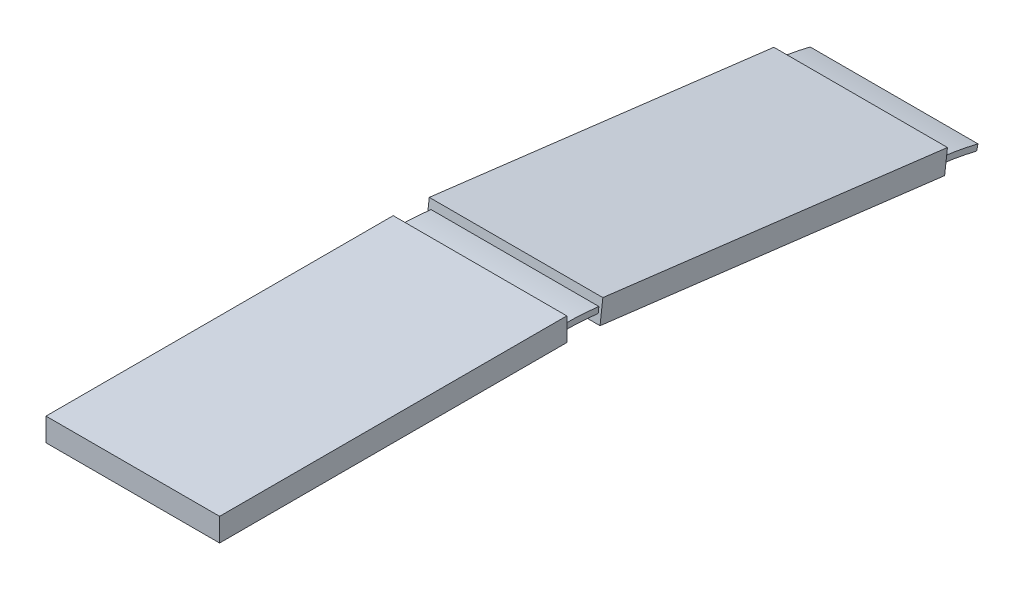
ISO-10303-21;
HEADER;
FILE_DESCRIPTION(('STEP AP214'),'2;1');
FILE_NAME('part.step','',(''),(''),'','','');
FILE_SCHEMA(('AUTOMOTIVE_DESIGN { 1 0 10303 214 1 1 1 1 }'));
ENDSEC;
DATA;
#1=APPLICATION_CONTEXT('core data for automotive mechanical design processes');
#2=APPLICATION_PROTOCOL_DEFINITION('international standard','automotive_design',2000,#1);
#3=PRODUCT_CONTEXT('',#1,'mechanical');
#4=PRODUCT('Part','Part','',(#3));
#5=PRODUCT_RELATED_PRODUCT_CATEGORY('part','',(#4));
#6=PRODUCT_DEFINITION_FORMATION('','',#4);
#7=PRODUCT_DEFINITION_CONTEXT('part definition',#1,'design');
#8=PRODUCT_DEFINITION('design','',#6,#7);
#9=PRODUCT_DEFINITION_SHAPE('','',#8);
#10=(LENGTH_UNIT() NAMED_UNIT(*) SI_UNIT(.MILLI.,.METRE.));
#11=(NAMED_UNIT(*) PLANE_ANGLE_UNIT() SI_UNIT($,.RADIAN.));
#12=(NAMED_UNIT(*) SI_UNIT($,.STERADIAN.) SOLID_ANGLE_UNIT());
#13=UNCERTAINTY_MEASURE_WITH_UNIT(LENGTH_MEASURE(1.E-05),#10,'distance_accuracy_value','');
#14=(GEOMETRIC_REPRESENTATION_CONTEXT(3) GLOBAL_UNCERTAINTY_ASSIGNED_CONTEXT((#13)) GLOBAL_UNIT_ASSIGNED_CONTEXT((#10,
#11,#12)) REPRESENTATION_CONTEXT('',''));
#15=CARTESIAN_POINT('',(0.,0.,0.));
#16=DIRECTION('',(0.,0.,1.));
#17=DIRECTION('',(1.,0.,0.));
#18=AXIS2_PLACEMENT_3D('',#15,#16,#17);
#19=CARTESIAN_POINT('',(-0.75,0.1,1.5));
#20=DIRECTION('',(1.,0.,0.));
#21=DIRECTION('',(0.,0.,-1.));
#22=AXIS2_PLACEMENT_3D('',#19,#20,#21);
#23=PLANE('',#22);
#24=DIRECTION('',(0.,0.,1.));
#25=VECTOR('',#24,1.);
#26=CARTESIAN_POINT('',(-0.75,-0.1,1.5));
#27=LINE('',#26,#25);
#28=CARTESIAN_POINT('',(-0.75,-0.1,-1.5));
#29=VERTEX_POINT('',#28);
#30=CARTESIAN_POINT('',(-0.75,-0.1,1.5));
#31=VERTEX_POINT('',#30);
#32=EDGE_CURVE('E303',#29,#31,#27,.T.);
#33=ORIENTED_EDGE('',*,*,#32,.T.);
#34=DIRECTION('',(0.,-1.,0.));
#35=VECTOR('',#34,1.);
#36=CARTESIAN_POINT('',(-0.75,0.1,1.5));
#37=LINE('',#36,#35);
#38=CARTESIAN_POINT('',(-0.75,0.1,1.5));
#39=VERTEX_POINT('',#38);
#40=EDGE_CURVE('E11',#39,#31,#37,.T.);
#41=ORIENTED_EDGE('',*,*,#40,.F.);
#42=DIRECTION('',(0.,0.,1.));
#43=VECTOR('',#42,1.);
#44=CARTESIAN_POINT('',(-0.75,0.1,1.5));
#45=LINE('',#44,#43);
#46=CARTESIAN_POINT('',(-0.75,0.1,-1.5));
#47=VERTEX_POINT('',#46);
#48=EDGE_CURVE('E304',#47,#39,#45,.T.);
#49=ORIENTED_EDGE('',*,*,#48,.F.);
#50=DIRECTION('',(0.,-1.,0.));
#51=VECTOR('',#50,1.);
#52=CARTESIAN_POINT('',(-0.75,0.1,-1.5));
#53=LINE('',#52,#51);
#54=EDGE_CURVE('E318',#47,#29,#53,.T.);
#55=ORIENTED_EDGE('',*,*,#54,.T.);
#56=EDGE_LOOP('',(#33,#41,#49,#55));
#57=FACE_BOUND('',#56,.T.);
#58=ADVANCED_FACE('F43',(#57),#23,.F.);
#59=CARTESIAN_POINT('',(0.75,0.1,1.5));
#60=DIRECTION('',(0.,0.,-1.));
#61=DIRECTION('',(-1.,0.,0.));
#62=AXIS2_PLACEMENT_3D('',#59,#60,#61);
#63=PLANE('',#62);
#64=DIRECTION('',(1.,0.,0.));
#65=VECTOR('',#64,1.);
#66=CARTESIAN_POINT('',(0.75,-0.1,1.5));
#67=LINE('',#66,#65);
#68=CARTESIAN_POINT('',(0.75,-0.1,1.5));
#69=VERTEX_POINT('',#68);
#70=EDGE_CURVE('E322',#31,#69,#67,.T.);
#71=ORIENTED_EDGE('',*,*,#70,.T.);
#72=DIRECTION('',(0.,-1.,0.));
#73=VECTOR('',#72,1.);
#74=CARTESIAN_POINT('',(0.75,0.1,1.5));
#75=LINE('',#74,#73);
#76=CARTESIAN_POINT('',(0.75,0.1,1.5));
#77=VERTEX_POINT('',#76);
#78=EDGE_CURVE('E51',#77,#69,#75,.T.);
#79=ORIENTED_EDGE('',*,*,#78,.F.);
#80=DIRECTION('',(1.,0.,0.));
#81=VECTOR('',#80,1.);
#82=CARTESIAN_POINT('',(0.75,0.1,1.5));
#83=LINE('',#82,#81);
#84=EDGE_CURVE('E308',#39,#77,#83,.T.);
#85=ORIENTED_EDGE('',*,*,#84,.F.);
#86=ORIENTED_EDGE('',*,*,#40,.T.);
#87=EDGE_LOOP('',(#71,#79,#85,#86));
#88=FACE_BOUND('',#87,.T.);
#89=ADVANCED_FACE('F358',(#88),#63,.F.);
#90=CARTESIAN_POINT('',(0.75,0.1,1.5));
#91=DIRECTION('',(-1.,0.,0.));
#92=DIRECTION('',(0.,0.,1.));
#93=AXIS2_PLACEMENT_3D('',#90,#91,#92);
#94=PLANE('',#93);
#95=DIRECTION('',(0.,0.,-1.));
#96=VECTOR('',#95,1.);
#97=CARTESIAN_POINT('',(0.75,-0.1,1.5));
#98=LINE('',#97,#96);
#99=CARTESIAN_POINT('',(0.75,-0.1,-1.5));
#100=VERTEX_POINT('',#99);
#101=EDGE_CURVE('E325',#69,#100,#98,.T.);
#102=ORIENTED_EDGE('',*,*,#101,.T.);
#103=DIRECTION('',(0.,-1.,0.));
#104=VECTOR('',#103,1.);
#105=CARTESIAN_POINT('',(0.75,0.1,-1.5));
#106=LINE('',#105,#104);
#107=CARTESIAN_POINT('',(0.75,0.1,-1.5));
#108=VERTEX_POINT('',#107);
#109=EDGE_CURVE('E333',#108,#100,#106,.T.);
#110=ORIENTED_EDGE('',*,*,#109,.F.);
#111=DIRECTION('',(0.,0.,-1.));
#112=VECTOR('',#111,1.);
#113=CARTESIAN_POINT('',(0.75,0.1,1.5));
#114=LINE('',#113,#112);
#115=EDGE_CURVE('E312',#77,#108,#114,.T.);
#116=ORIENTED_EDGE('',*,*,#115,.F.);
#117=ORIENTED_EDGE('',*,*,#78,.T.);
#118=EDGE_LOOP('',(#102,#110,#116,#117));
#119=FACE_BOUND('',#118,.T.);
#120=ADVANCED_FACE('F342',(#119),#94,.F.);
#121=CARTESIAN_POINT('',(0.75,0.1,-1.5));
#122=DIRECTION('',(0.,0.,1.));
#123=DIRECTION('',(1.,0.,0.));
#124=AXIS2_PLACEMENT_3D('',#121,#122,#123);
#125=PLANE('',#124);
#126=DIRECTION('',(-1.,0.,0.));
#127=VECTOR('',#126,1.);
#128=CARTESIAN_POINT('',(0.725,0.025,-1.5));
#129=LINE('',#128,#127);
#130=CARTESIAN_POINT('',(0.725,0.025,-1.5));
#131=VERTEX_POINT('',#130);
#132=CARTESIAN_POINT('',(-0.725,0.025,-1.5));
#133=VERTEX_POINT('',#132);
#134=EDGE_CURVE('E299',#131,#133,#129,.T.);
#135=ORIENTED_EDGE('',*,*,#134,.T.);
#136=DIRECTION('',(0.,-1.,0.));
#137=VECTOR('',#136,1.);
#138=CARTESIAN_POINT('',(-0.725,0.025,-1.5));
#139=LINE('',#138,#137);
#140=CARTESIAN_POINT('',(-0.725,-0.025,-1.5));
#141=VERTEX_POINT('',#140);
#142=EDGE_CURVE('E279',#133,#141,#139,.T.);
#143=ORIENTED_EDGE('',*,*,#142,.T.);
#144=DIRECTION('',(-1.,0.,0.));
#145=VECTOR('',#144,1.);
#146=CARTESIAN_POINT('',(0.725,-0.025,-1.5));
#147=LINE('',#146,#145);
#148=CARTESIAN_POINT('',(0.725,-0.025,-1.5));
#149=VERTEX_POINT('',#148);
#150=EDGE_CURVE('E296',#149,#141,#147,.T.);
#151=ORIENTED_EDGE('',*,*,#150,.F.);
#152=DIRECTION('',(0.,-1.,0.));
#153=VECTOR('',#152,1.);
#154=CARTESIAN_POINT('',(0.725,0.025,-1.5));
#155=LINE('',#154,#153);
#156=EDGE_CURVE('E266',#131,#149,#155,.T.);
#157=ORIENTED_EDGE('',*,*,#156,.F.);
#158=EDGE_LOOP('',(#135,#143,#151,#157));
#159=FACE_BOUND('',#158,.T.);
#160=DIRECTION('',(-1.,0.,0.));
#161=VECTOR('',#160,1.);
#162=CARTESIAN_POINT('',(0.75,-0.1,-1.5));
#163=LINE('',#162,#161);
#164=EDGE_CURVE('E309',#100,#29,#163,.T.);
#165=ORIENTED_EDGE('',*,*,#164,.T.);
#166=ORIENTED_EDGE('',*,*,#54,.F.);
#167=DIRECTION('',(-1.,0.,0.));
#168=VECTOR('',#167,1.);
#169=CARTESIAN_POINT('',(0.75,0.1,-1.5));
#170=LINE('',#169,#168);
#171=EDGE_CURVE('E315',#108,#47,#170,.T.);
#172=ORIENTED_EDGE('',*,*,#171,.F.);
#173=ORIENTED_EDGE('',*,*,#109,.T.);
#174=EDGE_LOOP('',(#165,#166,#172,#173));
#175=FACE_BOUND('',#174,.T.);
#176=ADVANCED_FACE('F351',(#159,#175),#125,.F.);
#177=CARTESIAN_POINT('',(0.,0.1,0.));
#178=DIRECTION('',(0.,1.,0.));
#179=DIRECTION('',(0.,0.,1.));
#180=AXIS2_PLACEMENT_3D('',#177,#178,#179);
#181=PLANE('',#180);
#182=ORIENTED_EDGE('',*,*,#48,.T.);
#183=ORIENTED_EDGE('',*,*,#84,.T.);
#184=ORIENTED_EDGE('',*,*,#115,.T.);
#185=ORIENTED_EDGE('',*,*,#171,.T.);
#186=EDGE_LOOP('',(#182,#183,#184,#185));
#187=FACE_BOUND('',#186,.T.);
#188=ADVANCED_FACE('F357',(#187),#181,.T.);
#189=CARTESIAN_POINT('',(0.,-0.1,0.));
#190=DIRECTION('',(0.,1.,0.));
#191=DIRECTION('',(0.,0.,1.));
#192=AXIS2_PLACEMENT_3D('',#189,#190,#191);
#193=PLANE('',#192);
#194=ORIENTED_EDGE('',*,*,#32,.F.);
#195=ORIENTED_EDGE('',*,*,#164,.F.);
#196=ORIENTED_EDGE('',*,*,#101,.F.);
#197=ORIENTED_EDGE('',*,*,#70,.F.);
#198=EDGE_LOOP('',(#194,#195,#196,#197));
#199=FACE_BOUND('',#198,.T.);
#200=ADVANCED_FACE('F348',(#199),#193,.F.);
#201=CARTESIAN_POINT('',(0.725,-2.45706123590973,-1.5));
#202=DIRECTION('',(-1.,0.,0.));
#203=DIRECTION('',(0.,0.,1.));
#204=AXIS2_PLACEMENT_3D('',#201,#202,#203);
#205=CYLINDRICAL_SURFACE('',#204,2.48206123590973);
#206=CARTESIAN_POINT('',(-0.725,-2.45706123590973,-1.5));
#207=DIRECTION('',(1.,0.,0.));
#208=DIRECTION('',(0.,0.,1.));
#209=AXIS2_PLACEMENT_3D('',#206,#207,#208);
#210=CIRCLE('',#209,2.48206123590973);
#211=CARTESIAN_POINT('',(-0.725,0.00649909193057586,-1.80248717311169));
#212=VERTEX_POINT('',#211);
#213=EDGE_CURVE('E69',#212,#133,#210,.T.);
#214=ORIENTED_EDGE('',*,*,#213,.T.);
#215=ORIENTED_EDGE('',*,*,#134,.F.);
#216=CARTESIAN_POINT('',(0.725,-2.45706123590973,-1.5));
#217=DIRECTION('',(1.,0.,0.));
#218=DIRECTION('',(0.,0.,1.));
#219=AXIS2_PLACEMENT_3D('',#216,#217,#218);
#220=CIRCLE('',#219,2.48206123590973);
#221=CARTESIAN_POINT('',(0.725,0.00649909193057586,-1.80248717311169));
#222=VERTEX_POINT('',#221);
#223=EDGE_CURVE('E263',#222,#131,#220,.T.);
#224=ORIENTED_EDGE('',*,*,#223,.F.);
#225=DIRECTION('',(-1.,0.,0.));
#226=VECTOR('',#225,1.);
#227=CARTESIAN_POINT('',(0.725,0.00649909193057586,-1.80248717311169));
#228=LINE('',#227,#226);
#229=EDGE_CURVE('E276',#222,#212,#228,.T.);
#230=ORIENTED_EDGE('',*,*,#229,.T.);
#231=EDGE_LOOP('',(#214,#215,#224,#230));
#232=FACE_BOUND('',#231,.T.);
#233=ADVANCED_FACE('F371',(#232),#205,.T.);
#234=CARTESIAN_POINT('',(0.725,-2.45706123590928,-1.50000000000003));
#235=DIRECTION('',(-1.,0.,0.));
#236=DIRECTION('',(0.,0.,1.));
#237=AXIS2_PLACEMENT_3D('',#234,#235,#236);
#238=CYLINDRICAL_SURFACE('',#237,2.43206123590928);
#239=CARTESIAN_POINT('',(-0.725,-2.45706123590928,-1.50000000000003));
#240=DIRECTION('',(-1.,0.,0.));
#241=DIRECTION('',(0.,0.,1.));
#242=AXIS2_PLACEMENT_3D('',#239,#240,#241);
#243=CIRCLE('',#242,2.43206123590928);
#244=CARTESIAN_POINT('',(-0.725,-0.0431282156514905,-1.79639370594143));
#245=VERTEX_POINT('',#244);
#246=EDGE_CURVE('E283',#141,#245,#243,.T.);
#247=ORIENTED_EDGE('',*,*,#246,.T.);
#248=DIRECTION('',(-1.,0.,0.));
#249=VECTOR('',#248,1.);
#250=CARTESIAN_POINT('',(0.725,-0.0431282156514905,-1.79639370594143));
#251=LINE('',#250,#249);
#252=CARTESIAN_POINT('',(0.725,-0.0431282156514905,-1.79639370594143));
#253=VERTEX_POINT('',#252);
#254=EDGE_CURVE('E292',#253,#245,#251,.T.);
#255=ORIENTED_EDGE('',*,*,#254,.F.);
#256=CARTESIAN_POINT('',(0.725,-2.45706123590928,-1.50000000000003));
#257=DIRECTION('',(-1.,0.,0.));
#258=DIRECTION('',(0.,0.,1.));
#259=AXIS2_PLACEMENT_3D('',#256,#257,#258);
#260=CIRCLE('',#259,2.43206123590928);
#261=EDGE_CURVE('E270',#149,#253,#260,.T.);
#262=ORIENTED_EDGE('',*,*,#261,.F.);
#263=ORIENTED_EDGE('',*,*,#150,.T.);
#264=EDGE_LOOP('',(#247,#255,#262,#263));
#265=FACE_BOUND('',#264,.T.);
#266=ADVANCED_FACE('F376',(#265),#238,.F.);
#267=CARTESIAN_POINT('',(0.725,-2.45706123590973,-1.5));
#268=DIRECTION('',(-1.,0.,0.));
#269=DIRECTION('',(0.,0.,1.));
#270=AXIS2_PLACEMENT_3D('',#267,#268,#269);
#271=PLANE('',#270);
#272=ORIENTED_EDGE('',*,*,#223,.T.);
#273=ORIENTED_EDGE('',*,*,#156,.T.);
#274=ORIENTED_EDGE('',*,*,#261,.T.);
#275=DIRECTION('',(0.,0.992546151641322,-0.121869343405151));
#276=VECTOR('',#275,1.);
#277=CARTESIAN_POINT('',(0.725,0.00649909193057586,-1.80248717311169));
#278=LINE('',#277,#276);
#279=EDGE_CURVE('E273',#253,#222,#278,.T.);
#280=ORIENTED_EDGE('',*,*,#279,.T.);
#281=EDGE_LOOP('',(#272,#273,#274,#280));
#282=FACE_BOUND('',#281,.T.);
#283=ADVANCED_FACE('F379',(#282),#271,.F.);
#284=CARTESIAN_POINT('',(-0.725,-2.45706123590973,-1.5));
#285=DIRECTION('',(-1.,0.,0.));
#286=DIRECTION('',(0.,0.,1.));
#287=AXIS2_PLACEMENT_3D('',#284,#285,#286);
#288=PLANE('',#287);
#289=ORIENTED_EDGE('',*,*,#213,.F.);
#290=DIRECTION('',(0.,0.992546151641322,-0.121869343405151));
#291=VECTOR('',#290,1.);
#292=CARTESIAN_POINT('',(-0.725,0.00649909193057586,-1.80248717311169));
#293=LINE('',#292,#291);
#294=EDGE_CURVE('E267',#245,#212,#293,.T.);
#295=ORIENTED_EDGE('',*,*,#294,.F.);
#296=ORIENTED_EDGE('',*,*,#246,.F.);
#297=ORIENTED_EDGE('',*,*,#142,.F.);
#298=EDGE_LOOP('',(#289,#295,#296,#297));
#299=FACE_BOUND('',#298,.T.);
#300=ADVANCED_FACE('F381',(#299),#288,.T.);
#301=CARTESIAN_POINT('',(0.75,-0.11756917702459,-1.78725350518605));
#302=DIRECTION('',(0.,-0.12186934340515,-0.992546151641322));
#303=DIRECTION('',(0.,0.992546151641322,-0.12186934340515));
#304=AXIS2_PLACEMENT_3D('',#301,#302,#303);
#305=PLANE('',#304);
#306=DIRECTION('',(0.,-0.992546151641322,0.12186934340515));
#307=VECTOR('',#306,1.);
#308=CARTESIAN_POINT('',(-0.75,-0.11756917702459,-1.78725350518605));
#309=LINE('',#308,#307);
#310=CARTESIAN_POINT('',(-0.75,0.0809400533036749,-1.81162737386708));
#311=VERTEX_POINT('',#310);
#312=CARTESIAN_POINT('',(-0.75,-0.11756917702459,-1.78725350518605));
#313=VERTEX_POINT('',#312);
#314=EDGE_CURVE('E227',#311,#313,#309,.T.);
#315=ORIENTED_EDGE('',*,*,#314,.T.);
#316=DIRECTION('',(-1.,0.,0.));
#317=VECTOR('',#316,1.);
#318=CARTESIAN_POINT('',(0.75,-0.11756917702459,-1.78725350518605));
#319=LINE('',#318,#317);
#320=CARTESIAN_POINT('',(0.75,-0.11756917702459,-1.78725350518605));
#321=VERTEX_POINT('',#320);
#322=EDGE_CURVE('E236',#321,#313,#319,.T.);
#323=ORIENTED_EDGE('',*,*,#322,.F.);
#324=DIRECTION('',(0.,-0.992546151641322,0.12186934340515));
#325=VECTOR('',#324,1.);
#326=CARTESIAN_POINT('',(0.75,-0.11756917702459,-1.78725350518605));
#327=LINE('',#326,#325);
#328=CARTESIAN_POINT('',(0.75,0.0809400533036749,-1.81162737386708));
#329=VERTEX_POINT('',#328);
#330=EDGE_CURVE('E233',#329,#321,#327,.T.);
#331=ORIENTED_EDGE('',*,*,#330,.F.);
#332=DIRECTION('',(-1.,0.,0.));
#333=VECTOR('',#332,1.);
#334=CARTESIAN_POINT('',(0.75,0.0809400533036749,-1.81162737386708));
#335=LINE('',#334,#333);
#336=EDGE_CURVE('E251',#329,#311,#335,.T.);
#337=ORIENTED_EDGE('',*,*,#336,.T.);
#338=EDGE_LOOP('',(#315,#323,#331,#337));
#339=FACE_BOUND('',#338,.T.);
#340=ORIENTED_EDGE('',*,*,#254,.T.);
#341=ORIENTED_EDGE('',*,*,#294,.T.);
#342=ORIENTED_EDGE('',*,*,#229,.F.);
#343=ORIENTED_EDGE('',*,*,#279,.F.);
#344=EDGE_LOOP('',(#340,#341,#342,#343));
#345=FACE_BOUND('',#344,.T.);
#346=ADVANCED_FACE('F384',(#339,#345),#305,.F.);
#347=CARTESIAN_POINT('',(0.75,-0.48317720724004,-4.76489196011001));
#348=DIRECTION('',(0.,0.992546151641322,-0.12186934340515));
#349=DIRECTION('',(0.,0.12186934340515,0.992546151641322));
#350=AXIS2_PLACEMENT_3D('',#347,#348,#349);
#351=PLANE('',#350);
#352=DIRECTION('',(0.,-0.12186934340515,-0.992546151641322));
#353=VECTOR('',#352,1.);
#354=CARTESIAN_POINT('',(-0.75,-0.48317720724004,-4.76489196011001));
#355=LINE('',#354,#353);
#356=CARTESIAN_POINT('',(-0.75,-0.48317720724004,-4.76489196011001));
#357=VERTEX_POINT('',#356);
#358=EDGE_CURVE('E189',#313,#357,#355,.T.);
#359=ORIENTED_EDGE('',*,*,#358,.T.);
#360=DIRECTION('',(-1.,0.,0.));
#361=VECTOR('',#360,1.);
#362=CARTESIAN_POINT('',(0.75,-0.48317720724004,-4.76489196011001));
#363=LINE('',#362,#361);
#364=CARTESIAN_POINT('',(0.75,-0.48317720724004,-4.76489196011001));
#365=VERTEX_POINT('',#364);
#366=EDGE_CURVE('E259',#365,#357,#363,.T.);
#367=ORIENTED_EDGE('',*,*,#366,.F.);
#368=DIRECTION('',(0.,-0.12186934340515,-0.992546151641322));
#369=VECTOR('',#368,1.);
#370=CARTESIAN_POINT('',(0.75,-0.48317720724004,-4.76489196011001));
#371=LINE('',#370,#369);
#372=EDGE_CURVE('E222',#321,#365,#371,.T.);
#373=ORIENTED_EDGE('',*,*,#372,.F.);
#374=ORIENTED_EDGE('',*,*,#322,.T.);
#375=EDGE_LOOP('',(#359,#367,#373,#374));
#376=FACE_BOUND('',#375,.T.);
#377=ADVANCED_FACE('F389',(#376),#351,.F.);
#378=CARTESIAN_POINT('',(0.75,-0.284667976911774,-4.78926582879104));
#379=DIRECTION('',(0.,0.12186934340515,0.992546151641322));
#380=DIRECTION('',(0.,-0.992546151641322,0.12186934340515));
#381=AXIS2_PLACEMENT_3D('',#378,#379,#380);
#382=PLANE('',#381);
#383=DIRECTION('',(-1.,0.,0.));
#384=VECTOR('',#383,1.);
#385=CARTESIAN_POINT('',(0.725,-0.359108938284874,-4.78012562803566));
#386=LINE('',#385,#384);
#387=CARTESIAN_POINT('',(0.725,-0.359108938284874,-4.78012562803566));
#388=VERTEX_POINT('',#387);
#389=CARTESIAN_POINT('',(-0.725,-0.359108938284874,-4.78012562803566));
#390=VERTEX_POINT('',#389);
#391=EDGE_CURVE('E184',#388,#390,#386,.T.);
#392=ORIENTED_EDGE('',*,*,#391,.T.);
#393=DIRECTION('',(0.,-0.992546151641323,0.121869343405138));
#394=VECTOR('',#393,1.);
#395=CARTESIAN_POINT('',(-0.725,-0.359108938284874,-4.78012562803566));
#396=LINE('',#395,#394);
#397=CARTESIAN_POINT('',(-0.725,-0.40873624586694,-4.7740321608654));
#398=VERTEX_POINT('',#397);
#399=EDGE_CURVE('E206',#390,#398,#396,.T.);
#400=ORIENTED_EDGE('',*,*,#399,.T.);
#401=DIRECTION('',(-1.,0.,0.));
#402=VECTOR('',#401,1.);
#403=CARTESIAN_POINT('',(0.725,-0.40873624586694,-4.7740321608654));
#404=LINE('',#403,#402);
#405=CARTESIAN_POINT('',(0.725,-0.40873624586694,-4.7740321608654));
#406=VERTEX_POINT('',#405);
#407=EDGE_CURVE('E190',#406,#398,#404,.T.);
#408=ORIENTED_EDGE('',*,*,#407,.F.);
#409=DIRECTION('',(0.,-0.992546151641323,0.121869343405138));
#410=VECTOR('',#409,1.);
#411=CARTESIAN_POINT('',(0.725,-0.359108938284874,-4.78012562803566));
#412=LINE('',#411,#410);
#413=EDGE_CURVE('E175',#388,#406,#412,.T.);
#414=ORIENTED_EDGE('',*,*,#413,.F.);
#415=EDGE_LOOP('',(#392,#400,#408,#414));
#416=FACE_BOUND('',#415,.T.);
#417=DIRECTION('',(0.,0.992546151641322,-0.12186934340515));
#418=VECTOR('',#417,1.);
#419=CARTESIAN_POINT('',(-0.75,-0.284667976911774,-4.78926582879104));
#420=LINE('',#419,#418);
#421=CARTESIAN_POINT('',(-0.75,-0.284667976911774,-4.78926582879104));
#422=VERTEX_POINT('',#421);
#423=EDGE_CURVE('E240',#357,#422,#420,.T.);
#424=ORIENTED_EDGE('',*,*,#423,.T.);
#425=DIRECTION('',(-1.,0.,0.));
#426=VECTOR('',#425,1.);
#427=CARTESIAN_POINT('',(0.75,-0.284667976911774,-4.78926582879104));
#428=LINE('',#427,#426);
#429=CARTESIAN_POINT('',(0.75,-0.284667976911774,-4.78926582879104));
#430=VERTEX_POINT('',#429);
#431=EDGE_CURVE('E255',#430,#422,#428,.T.);
#432=ORIENTED_EDGE('',*,*,#431,.F.);
#433=DIRECTION('',(0.,0.992546151641322,-0.12186934340515));
#434=VECTOR('',#433,1.);
#435=CARTESIAN_POINT('',(0.75,-0.284667976911774,-4.78926582879104));
#436=LINE('',#435,#434);
#437=EDGE_CURVE('E226',#365,#430,#436,.T.);
#438=ORIENTED_EDGE('',*,*,#437,.F.);
#439=ORIENTED_EDGE('',*,*,#366,.T.);
#440=EDGE_LOOP('',(#424,#432,#438,#439));
#441=FACE_BOUND('',#440,.T.);
#442=ADVANCED_FACE('F193',(#416,#441),#382,.F.);
#443=CARTESIAN_POINT('',(0.75,0.0809400533036749,-1.81162737386708));
#444=DIRECTION('',(0.,-0.992546151641322,0.12186934340515));
#445=DIRECTION('',(0.,-0.12186934340515,-0.992546151641322));
#446=AXIS2_PLACEMENT_3D('',#443,#444,#445);
#447=PLANE('',#446);
#448=DIRECTION('',(0.,0.12186934340515,0.992546151641322));
#449=VECTOR('',#448,1.);
#450=CARTESIAN_POINT('',(-0.75,0.0809400533036749,-1.81162737386708));
#451=LINE('',#450,#449);
#452=EDGE_CURVE('E243',#422,#311,#451,.T.);
#453=ORIENTED_EDGE('',*,*,#452,.T.);
#454=ORIENTED_EDGE('',*,*,#336,.F.);
#455=DIRECTION('',(0.,0.12186934340515,0.992546151641322));
#456=VECTOR('',#455,1.);
#457=CARTESIAN_POINT('',(0.75,0.0809400533036749,-1.81162737386708));
#458=LINE('',#457,#456);
#459=EDGE_CURVE('E230',#430,#329,#458,.T.);
#460=ORIENTED_EDGE('',*,*,#459,.F.);
#461=ORIENTED_EDGE('',*,*,#431,.T.);
#462=EDGE_LOOP('',(#453,#454,#460,#461));
#463=FACE_BOUND('',#462,.T.);
#464=ADVANCED_FACE('F395',(#463),#447,.F.);
#465=CARTESIAN_POINT('',(0.75,0.,0.));
#466=DIRECTION('',(-1.,0.,0.));
#467=DIRECTION('',(0.,0.,1.));
#468=AXIS2_PLACEMENT_3D('',#465,#466,#467);
#469=PLANE('',#468);
#470=ORIENTED_EDGE('',*,*,#372,.T.);
#471=ORIENTED_EDGE('',*,*,#437,.T.);
#472=ORIENTED_EDGE('',*,*,#459,.T.);
#473=ORIENTED_EDGE('',*,*,#330,.T.);
#474=EDGE_LOOP('',(#470,#471,#472,#473));
#475=FACE_BOUND('',#474,.T.);
#476=ADVANCED_FACE('F398',(#475),#469,.F.);
#477=CARTESIAN_POINT('',(-0.75,0.,0.));
#478=DIRECTION('',(-1.,0.,0.));
#479=DIRECTION('',(0.,0.,1.));
#480=AXIS2_PLACEMENT_3D('',#477,#478,#479);
#481=PLANE('',#480);
#482=ORIENTED_EDGE('',*,*,#358,.F.);
#483=ORIENTED_EDGE('',*,*,#314,.F.);
#484=ORIENTED_EDGE('',*,*,#452,.F.);
#485=ORIENTED_EDGE('',*,*,#423,.F.);
#486=EDGE_LOOP('',(#482,#483,#484,#485));
#487=FACE_BOUND('',#486,.T.);
#488=ADVANCED_FACE('F403',(#487),#481,.T.);
#489=CARTESIAN_POINT('',(0.725,-2.82266926612516,-4.47763845492397));
#490=DIRECTION('',(-1.,0.,0.));
#491=DIRECTION('',(0.,0.,1.));
#492=AXIS2_PLACEMENT_3D('',#489,#490,#491);
#493=CYLINDRICAL_SURFACE('',#492,2.48206123590972);
#494=CARTESIAN_POINT('',(-0.725,-2.82266926612516,-4.47763845492397));
#495=DIRECTION('',(1.,0.,0.));
#496=DIRECTION('',(0.,0.,1.));
#497=AXIS2_PLACEMENT_3D('',#494,#495,#496);
#498=CIRCLE('',#497,2.48206123590972);
#499=CARTESIAN_POINT('',(-0.725,-0.414335856566652,-5.07810341410971));
#500=VERTEX_POINT('',#499);
#501=EDGE_CURVE('E58',#500,#390,#498,.T.);
#502=ORIENTED_EDGE('',*,*,#501,.T.);
#503=ORIENTED_EDGE('',*,*,#391,.F.);
#504=CARTESIAN_POINT('',(0.725,-2.82266926612516,-4.47763845492397));
#505=DIRECTION('',(1.,0.,0.));
#506=DIRECTION('',(0.,0.,1.));
#507=AXIS2_PLACEMENT_3D('',#504,#505,#506);
#508=CIRCLE('',#507,2.48206123590972);
#509=CARTESIAN_POINT('',(0.725,-0.414335856566652,-5.07810341410971));
#510=VERTEX_POINT('',#509);
#511=EDGE_CURVE('E172',#510,#388,#508,.T.);
#512=ORIENTED_EDGE('',*,*,#511,.F.);
#513=DIRECTION('',(-1.,0.,0.));
#514=VECTOR('',#513,1.);
#515=CARTESIAN_POINT('',(0.725,-0.414335856566652,-5.07810341410971));
#516=LINE('',#515,#514);
#517=EDGE_CURVE('E203',#510,#500,#516,.T.);
#518=ORIENTED_EDGE('',*,*,#517,.T.);
#519=EDGE_LOOP('',(#502,#503,#512,#518));
#520=FACE_BOUND('',#519,.T.);
#521=ADVANCED_FACE('F185',(#520),#493,.T.);
#522=CARTESIAN_POINT('',(0.725,-2.82266926612512,-4.47763845492397));
#523=DIRECTION('',(-1.,0.,0.));
#524=DIRECTION('',(0.,0.,1.));
#525=AXIS2_PLACEMENT_3D('',#522,#523,#524);
#526=CYLINDRICAL_SURFACE('',#525,2.43206123590967);
#527=CARTESIAN_POINT('',(-0.725,-2.82266926612512,-4.47763845492397));
#528=DIRECTION('',(-1.,0.,0.));
#529=DIRECTION('',(0.,0.,1.));
#530=AXIS2_PLACEMENT_3D('',#527,#528,#529);
#531=CIRCLE('',#530,2.43206123590967);
#532=CARTESIAN_POINT('',(-0.725,-0.462850642880452,-5.06600731932972));
#533=VERTEX_POINT('',#532);
#534=EDGE_CURVE('E209',#398,#533,#531,.T.);
#535=ORIENTED_EDGE('',*,*,#534,.T.);
#536=DIRECTION('',(-1.,0.,0.));
#537=VECTOR('',#536,1.);
#538=CARTESIAN_POINT('',(0.725,-0.462850642880452,-5.06600731932972));
#539=LINE('',#538,#537);
#540=CARTESIAN_POINT('',(0.725,-0.462850642880452,-5.06600731932972));
#541=VERTEX_POINT('',#540);
#542=EDGE_CURVE('E216',#541,#533,#539,.T.);
#543=ORIENTED_EDGE('',*,*,#542,.F.);
#544=CARTESIAN_POINT('',(0.725,-2.82266926612512,-4.47763845492397));
#545=DIRECTION('',(-1.,0.,0.));
#546=DIRECTION('',(0.,0.,1.));
#547=AXIS2_PLACEMENT_3D('',#544,#545,#546);
#548=CIRCLE('',#547,2.43206123590967);
#549=EDGE_CURVE('E196',#406,#541,#548,.T.);
#550=ORIENTED_EDGE('',*,*,#549,.F.);
#551=ORIENTED_EDGE('',*,*,#407,.T.);
#552=EDGE_LOOP('',(#535,#543,#550,#551));
#553=FACE_BOUND('',#552,.T.);
#554=ADVANCED_FACE('F412',(#553),#526,.F.);
#555=CARTESIAN_POINT('',(0.725,-0.414335856566652,-5.07810341410971));
#556=DIRECTION('',(0.,0.241921895599693,0.97029572627599));
#557=DIRECTION('',(0.,-0.97029572627599,0.241921895599693));
#558=AXIS2_PLACEMENT_3D('',#555,#556,#557);
#559=PLANE('',#558);
#560=DIRECTION('',(0.,0.97029572627599,-0.241921895599693));
#561=VECTOR('',#560,1.);
#562=CARTESIAN_POINT('',(-0.725,-0.414335856566652,-5.07810341410971));
#563=LINE('',#562,#561);
#564=EDGE_CURVE('E181',#533,#500,#563,.T.);
#565=ORIENTED_EDGE('',*,*,#564,.T.);
#566=ORIENTED_EDGE('',*,*,#517,.F.);
#567=DIRECTION('',(0.,0.97029572627599,-0.241921895599693));
#568=VECTOR('',#567,1.);
#569=CARTESIAN_POINT('',(0.725,-0.414335856566652,-5.07810341410971));
#570=LINE('',#569,#568);
#571=EDGE_CURVE('E178',#541,#510,#570,.T.);
#572=ORIENTED_EDGE('',*,*,#571,.F.);
#573=ORIENTED_EDGE('',*,*,#542,.T.);
#574=EDGE_LOOP('',(#565,#566,#572,#573));
#575=FACE_BOUND('',#574,.T.);
#576=ADVANCED_FACE('F415',(#575),#559,.F.);
#577=CARTESIAN_POINT('',(0.725,-2.82266926612516,-4.47763845492397));
#578=DIRECTION('',(-1.,0.,0.));
#579=DIRECTION('',(0.,0.,1.));
#580=AXIS2_PLACEMENT_3D('',#577,#578,#579);
#581=PLANE('',#580);
#582=ORIENTED_EDGE('',*,*,#511,.T.);
#583=ORIENTED_EDGE('',*,*,#413,.T.);
#584=ORIENTED_EDGE('',*,*,#549,.T.);
#585=ORIENTED_EDGE('',*,*,#571,.T.);
#586=EDGE_LOOP('',(#582,#583,#584,#585));
#587=FACE_BOUND('',#586,.T.);
#588=ADVANCED_FACE('F173',(#587),#581,.F.);
#589=CARTESIAN_POINT('',(-0.725,-2.82266926612516,-4.47763845492397));
#590=DIRECTION('',(-1.,0.,0.));
#591=DIRECTION('',(0.,0.,1.));
#592=AXIS2_PLACEMENT_3D('',#589,#590,#591);
#593=PLANE('',#592);
#594=ORIENTED_EDGE('',*,*,#501,.F.);
#595=ORIENTED_EDGE('',*,*,#564,.F.);
#596=ORIENTED_EDGE('',*,*,#534,.F.);
#597=ORIENTED_EDGE('',*,*,#399,.F.);
#598=EDGE_LOOP('',(#594,#595,#596,#597));
#599=FACE_BOUND('',#598,.T.);
#600=ADVANCED_FACE('F420',(#599),#593,.T.);
#601=CLOSED_SHELL('',(#58,#89,#120,#176,#188,#200,#233,#266,#283,#300,#346,#377,#442,#464,#476,
#488,#521,#554,#576,#588,#600));
#602=MANIFOLD_SOLID_BREP('B2',#601);
#603=ADVANCED_BREP_SHAPE_REPRESENTATION('',(#18,#602),#14);
#604=SHAPE_DEFINITION_REPRESENTATION(#9,#603);
ENDSEC;
END-ISO-10303-21;
